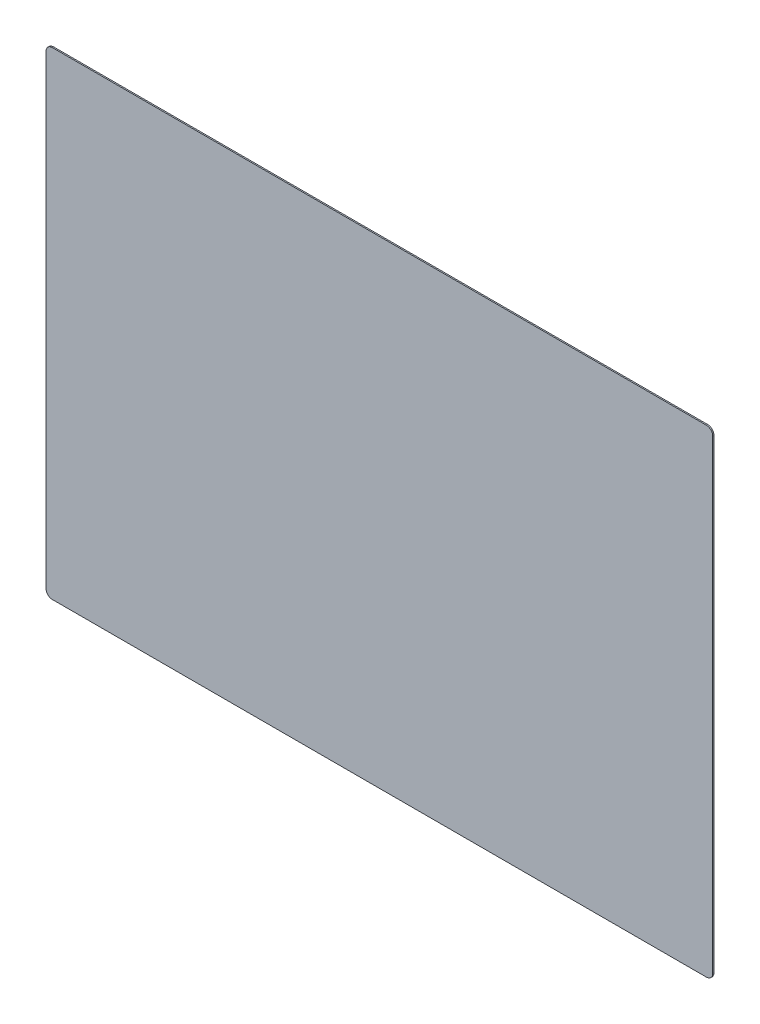
ISO-10303-21;
HEADER;
FILE_DESCRIPTION(('STEP AP214'),'2;1');
FILE_NAME('part.step','',(''),(''),'','','');
FILE_SCHEMA(('AUTOMOTIVE_DESIGN { 1 0 10303 214 1 1 1 1 }'));
ENDSEC;
DATA;
#1=APPLICATION_CONTEXT('core data for automotive mechanical design processes');
#2=APPLICATION_PROTOCOL_DEFINITION('international standard','automotive_design',2000,#1);
#3=PRODUCT_CONTEXT('',#1,'mechanical');
#4=PRODUCT('Part','Part','',(#3));
#5=PRODUCT_RELATED_PRODUCT_CATEGORY('part','',(#4));
#6=PRODUCT_DEFINITION_FORMATION('','',#4);
#7=PRODUCT_DEFINITION_CONTEXT('part definition',#1,'design');
#8=PRODUCT_DEFINITION('design','',#6,#7);
#9=PRODUCT_DEFINITION_SHAPE('','',#8);
#10=(LENGTH_UNIT() NAMED_UNIT(*) SI_UNIT(.MILLI.,.METRE.));
#11=(NAMED_UNIT(*) PLANE_ANGLE_UNIT() SI_UNIT($,.RADIAN.));
#12=(NAMED_UNIT(*) SI_UNIT($,.STERADIAN.) SOLID_ANGLE_UNIT());
#13=UNCERTAINTY_MEASURE_WITH_UNIT(LENGTH_MEASURE(1.E-05),#10,'distance_accuracy_value','');
#14=(GEOMETRIC_REPRESENTATION_CONTEXT(3) GLOBAL_UNCERTAINTY_ASSIGNED_CONTEXT((#13)) GLOBAL_UNIT_ASSIGNED_CONTEXT((#10,
#11,#12)) REPRESENTATION_CONTEXT('',''));
#15=CARTESIAN_POINT('',(0.,0.,0.));
#16=DIRECTION('',(0.,0.,1.));
#17=DIRECTION('',(1.,0.,0.));
#18=AXIS2_PLACEMENT_3D('',#15,#16,#17);
#19=CARTESIAN_POINT('',(0.,0.,0.100000000000003));
#20=DIRECTION('',(0.,0.,-1.));
#21=DIRECTION('',(-1.,0.,0.));
#22=AXIS2_PLACEMENT_3D('',#19,#20,#21);
#23=PLANE('',#22);
#24=CARTESIAN_POINT('',(-26.,18.5,0.0999999999999959));
#25=DIRECTION('',(0.,0.,-1.));
#26=DIRECTION('',(-1.,0.,0.));
#27=AXIS2_PLACEMENT_3D('',#24,#25,#26);
#28=CIRCLE('',#27,0.5);
#29=CARTESIAN_POINT('',(-26.5,18.5,0.0999999999999959));
#30=VERTEX_POINT('',#29);
#31=CARTESIAN_POINT('',(-26.,19.,0.0999999999999959));
#32=VERTEX_POINT('',#31);
#33=EDGE_CURVE('E89',#30,#32,#28,.T.);
#34=ORIENTED_EDGE('',*,*,#33,.F.);
#35=DIRECTION('',(0.,1.,0.));
#36=VECTOR('',#35,1.);
#37=CARTESIAN_POINT('',(-26.5,-19.,0.0999999999999959));
#38=LINE('',#37,#36);
#39=CARTESIAN_POINT('',(-26.5,-18.5,0.0999999999999959));
#40=VERTEX_POINT('',#39);
#41=EDGE_CURVE('E86',#30,#40,#38,.F.);
#42=ORIENTED_EDGE('',*,*,#41,.T.);
#43=CARTESIAN_POINT('',(-26.,-18.5,0.0999999999999959));
#44=DIRECTION('',(0.,0.,-1.));
#45=DIRECTION('',(-1.,0.,0.));
#46=AXIS2_PLACEMENT_3D('',#43,#44,#45);
#47=CIRCLE('',#46,0.5);
#48=CARTESIAN_POINT('',(-26.,-19.,0.0999999999999959));
#49=VERTEX_POINT('',#48);
#50=EDGE_CURVE('E20',#49,#40,#47,.T.);
#51=ORIENTED_EDGE('',*,*,#50,.F.);
#52=DIRECTION('',(1.,0.,0.));
#53=VECTOR('',#52,1.);
#54=CARTESIAN_POINT('',(-26.5,-19.,0.0999999999999959));
#55=LINE('',#54,#53);
#56=CARTESIAN_POINT('',(26.,-19.,0.0999999999999959));
#57=VERTEX_POINT('',#56);
#58=EDGE_CURVE('E96',#49,#57,#55,.T.);
#59=ORIENTED_EDGE('',*,*,#58,.T.);
#60=CARTESIAN_POINT('',(26.,-18.5,0.0999999999999959));
#61=DIRECTION('',(0.,0.,-1.));
#62=DIRECTION('',(-1.,0.,0.));
#63=AXIS2_PLACEMENT_3D('',#60,#61,#62);
#64=CIRCLE('',#63,0.5);
#65=CARTESIAN_POINT('',(26.5,-18.5,0.0999999999999959));
#66=VERTEX_POINT('',#65);
#67=EDGE_CURVE('E108',#66,#57,#64,.T.);
#68=ORIENTED_EDGE('',*,*,#67,.F.);
#69=DIRECTION('',(0.,1.,0.));
#70=VECTOR('',#69,1.);
#71=CARTESIAN_POINT('',(26.5,-19.,0.0999999999999959));
#72=LINE('',#71,#70);
#73=CARTESIAN_POINT('',(26.5,18.5,0.0999999999999959));
#74=VERTEX_POINT('',#73);
#75=EDGE_CURVE('E111',#66,#74,#72,.T.);
#76=ORIENTED_EDGE('',*,*,#75,.T.);
#77=CARTESIAN_POINT('',(26.,18.5,0.0999999999999959));
#78=DIRECTION('',(0.,0.,-1.));
#79=DIRECTION('',(-1.,0.,0.));
#80=AXIS2_PLACEMENT_3D('',#77,#78,#79);
#81=CIRCLE('',#80,0.5);
#82=CARTESIAN_POINT('',(26.,19.,0.0999999999999959));
#83=VERTEX_POINT('',#82);
#84=EDGE_CURVE('E115',#83,#74,#81,.T.);
#85=ORIENTED_EDGE('',*,*,#84,.F.);
#86=DIRECTION('',(1.,0.,0.));
#87=VECTOR('',#86,1.);
#88=CARTESIAN_POINT('',(-26.5,19.,0.0999999999999959));
#89=LINE('',#88,#87);
#90=EDGE_CURVE('E118',#83,#32,#89,.F.);
#91=ORIENTED_EDGE('',*,*,#90,.T.);
#92=EDGE_LOOP('',(#34,#42,#51,#59,#68,#76,#85,#91));
#93=FACE_BOUND('',#92,.T.);
#94=ADVANCED_FACE('F17',(#93),#23,.F.);
#95=CARTESIAN_POINT('',(-26.5,-19.,0.0999999999999959));
#96=DIRECTION('',(1.,0.,0.));
#97=DIRECTION('',(0.,0.,-1.));
#98=AXIS2_PLACEMENT_3D('',#95,#96,#97);
#99=PLANE('',#98);
#100=DIRECTION('',(0.,0.,-1.));
#101=VECTOR('',#100,1.);
#102=CARTESIAN_POINT('',(-26.5,18.5,0.0999999999999959));
#103=LINE('',#102,#101);
#104=CARTESIAN_POINT('',(-26.5,18.5,0.));
#105=VERTEX_POINT('',#104);
#106=EDGE_CURVE('E119',#105,#30,#103,.F.);
#107=ORIENTED_EDGE('',*,*,#106,.F.);
#108=DIRECTION('',(0.,1.,0.));
#109=VECTOR('',#108,1.);
#110=CARTESIAN_POINT('',(-26.5,0.,0.));
#111=LINE('',#110,#109);
#112=CARTESIAN_POINT('',(-26.5,-18.5,0.));
#113=VERTEX_POINT('',#112);
#114=EDGE_CURVE('E95',#113,#105,#111,.T.);
#115=ORIENTED_EDGE('',*,*,#114,.F.);
#116=DIRECTION('',(0.,0.,-1.));
#117=VECTOR('',#116,1.);
#118=CARTESIAN_POINT('',(-26.5,-18.5,0.0999999999999959));
#119=LINE('',#118,#117);
#120=EDGE_CURVE('E85',#40,#113,#119,.T.);
#121=ORIENTED_EDGE('',*,*,#120,.F.);
#122=ORIENTED_EDGE('',*,*,#41,.F.);
#123=EDGE_LOOP('',(#107,#115,#121,#122));
#124=FACE_BOUND('',#123,.T.);
#125=ADVANCED_FACE('F93',(#124),#99,.F.);
#126=CARTESIAN_POINT('',(-26.,18.5,0.0999999999999959));
#127=DIRECTION('',(0.,0.,-1.));
#128=DIRECTION('',(-1.,0.,0.));
#129=AXIS2_PLACEMENT_3D('',#126,#127,#128);
#130=CYLINDRICAL_SURFACE('',#129,0.5);
#131=CARTESIAN_POINT('',(-26.,18.5,0.));
#132=DIRECTION('',(0.,0.,-1.));
#133=DIRECTION('',(-1.,0.,0.));
#134=AXIS2_PLACEMENT_3D('',#131,#132,#133);
#135=CIRCLE('',#134,0.5);
#136=CARTESIAN_POINT('',(-26.,19.,0.));
#137=VERTEX_POINT('',#136);
#138=EDGE_CURVE('E132',#105,#137,#135,.T.);
#139=ORIENTED_EDGE('',*,*,#138,.F.);
#140=ORIENTED_EDGE('',*,*,#106,.T.);
#141=ORIENTED_EDGE('',*,*,#33,.T.);
#142=DIRECTION('',(0.,0.,-1.));
#143=VECTOR('',#142,1.);
#144=CARTESIAN_POINT('',(-26.,19.,0.0999999999999959));
#145=LINE('',#144,#143);
#146=EDGE_CURVE('E116',#32,#137,#145,.T.);
#147=ORIENTED_EDGE('',*,*,#146,.T.);
#148=EDGE_LOOP('',(#139,#140,#141,#147));
#149=FACE_BOUND('',#148,.T.);
#150=ADVANCED_FACE('F139',(#149),#130,.T.);
#151=CARTESIAN_POINT('',(-26.5,19.,0.0999999999999959));
#152=DIRECTION('',(0.,-1.,0.));
#153=DIRECTION('',(0.,0.,-1.));
#154=AXIS2_PLACEMENT_3D('',#151,#152,#153);
#155=PLANE('',#154);
#156=ORIENTED_EDGE('',*,*,#146,.F.);
#157=ORIENTED_EDGE('',*,*,#90,.F.);
#158=DIRECTION('',(0.,0.,-1.));
#159=VECTOR('',#158,1.);
#160=CARTESIAN_POINT('',(26.,19.,0.0999999999999959));
#161=LINE('',#160,#159);
#162=CARTESIAN_POINT('',(26.,19.,0.));
#163=VERTEX_POINT('',#162);
#164=EDGE_CURVE('E112',#163,#83,#161,.F.);
#165=ORIENTED_EDGE('',*,*,#164,.F.);
#166=DIRECTION('',(-1.,0.,0.));
#167=VECTOR('',#166,1.);
#168=CARTESIAN_POINT('',(0.,19.,0.));
#169=LINE('',#168,#167);
#170=EDGE_CURVE('E131',#137,#163,#169,.F.);
#171=ORIENTED_EDGE('',*,*,#170,.F.);
#172=EDGE_LOOP('',(#156,#157,#165,#171));
#173=FACE_BOUND('',#172,.T.);
#174=ADVANCED_FACE('F143',(#173),#155,.F.);
#175=CARTESIAN_POINT('',(26.,18.5,0.0999999999999959));
#176=DIRECTION('',(0.,0.,-1.));
#177=DIRECTION('',(-1.,0.,0.));
#178=AXIS2_PLACEMENT_3D('',#175,#176,#177);
#179=CYLINDRICAL_SURFACE('',#178,0.5);
#180=CARTESIAN_POINT('',(26.,18.5,0.));
#181=DIRECTION('',(0.,0.,-1.));
#182=DIRECTION('',(-1.,0.,0.));
#183=AXIS2_PLACEMENT_3D('',#180,#181,#182);
#184=CIRCLE('',#183,0.5);
#185=CARTESIAN_POINT('',(26.5,18.5,0.));
#186=VERTEX_POINT('',#185);
#187=EDGE_CURVE('E128',#163,#186,#184,.T.);
#188=ORIENTED_EDGE('',*,*,#187,.F.);
#189=ORIENTED_EDGE('',*,*,#164,.T.);
#190=ORIENTED_EDGE('',*,*,#84,.T.);
#191=DIRECTION('',(0.,0.,1.));
#192=VECTOR('',#191,1.);
#193=CARTESIAN_POINT('',(26.5,18.5,0.0999999999999959));
#194=LINE('',#193,#192);
#195=EDGE_CURVE('E109',#74,#186,#194,.F.);
#196=ORIENTED_EDGE('',*,*,#195,.T.);
#197=EDGE_LOOP('',(#188,#189,#190,#196));
#198=FACE_BOUND('',#197,.T.);
#199=ADVANCED_FACE('F163',(#198),#179,.T.);
#200=CARTESIAN_POINT('',(26.5,-19.,0.0999999999999959));
#201=DIRECTION('',(-1.,0.,0.));
#202=DIRECTION('',(0.,0.,1.));
#203=AXIS2_PLACEMENT_3D('',#200,#201,#202);
#204=PLANE('',#203);
#205=DIRECTION('',(0.,0.,-1.));
#206=VECTOR('',#205,1.);
#207=CARTESIAN_POINT('',(26.5,-18.5,0.0999999999999959));
#208=LINE('',#207,#206);
#209=CARTESIAN_POINT('',(26.5,-18.5,0.));
#210=VERTEX_POINT('',#209);
#211=EDGE_CURVE('E105',#210,#66,#208,.F.);
#212=ORIENTED_EDGE('',*,*,#211,.F.);
#213=DIRECTION('',(0.,1.,0.));
#214=VECTOR('',#213,1.);
#215=CARTESIAN_POINT('',(26.5,0.,0.));
#216=LINE('',#215,#214);
#217=EDGE_CURVE('E127',#186,#210,#216,.F.);
#218=ORIENTED_EDGE('',*,*,#217,.F.);
#219=ORIENTED_EDGE('',*,*,#195,.F.);
#220=ORIENTED_EDGE('',*,*,#75,.F.);
#221=EDGE_LOOP('',(#212,#218,#219,#220));
#222=FACE_BOUND('',#221,.T.);
#223=ADVANCED_FACE('F157',(#222),#204,.F.);
#224=CARTESIAN_POINT('',(26.,-18.5,0.0999999999999959));
#225=DIRECTION('',(0.,0.,-1.));
#226=DIRECTION('',(-1.,0.,0.));
#227=AXIS2_PLACEMENT_3D('',#224,#225,#226);
#228=CYLINDRICAL_SURFACE('',#227,0.5);
#229=CARTESIAN_POINT('',(26.,-18.5,0.));
#230=DIRECTION('',(0.,0.,-1.));
#231=DIRECTION('',(-1.,0.,0.));
#232=AXIS2_PLACEMENT_3D('',#229,#230,#231);
#233=CIRCLE('',#232,0.5);
#234=CARTESIAN_POINT('',(26.,-19.,0.));
#235=VERTEX_POINT('',#234);
#236=EDGE_CURVE('E124',#210,#235,#233,.T.);
#237=ORIENTED_EDGE('',*,*,#236,.F.);
#238=ORIENTED_EDGE('',*,*,#211,.T.);
#239=ORIENTED_EDGE('',*,*,#67,.T.);
#240=DIRECTION('',(0.,0.,1.));
#241=VECTOR('',#240,1.);
#242=CARTESIAN_POINT('',(26.,-19.,0.0999999999999959));
#243=LINE('',#242,#241);
#244=EDGE_CURVE('E99',#57,#235,#243,.F.);
#245=ORIENTED_EDGE('',*,*,#244,.T.);
#246=EDGE_LOOP('',(#237,#238,#239,#245));
#247=FACE_BOUND('',#246,.T.);
#248=ADVANCED_FACE('F160',(#247),#228,.T.);
#249=CARTESIAN_POINT('',(-26.5,-19.,0.0999999999999959));
#250=DIRECTION('',(0.,1.,0.));
#251=DIRECTION('',(0.,0.,1.));
#252=AXIS2_PLACEMENT_3D('',#249,#250,#251);
#253=PLANE('',#252);
#254=DIRECTION('',(0.,0.,-1.));
#255=VECTOR('',#254,1.);
#256=CARTESIAN_POINT('',(-26.,-19.,0.0999999999999959));
#257=LINE('',#256,#255);
#258=CARTESIAN_POINT('',(-26.,-19.,0.));
#259=VERTEX_POINT('',#258);
#260=EDGE_CURVE('E35',#259,#49,#257,.F.);
#261=ORIENTED_EDGE('',*,*,#260,.F.);
#262=DIRECTION('',(-1.,0.,0.));
#263=VECTOR('',#262,1.);
#264=CARTESIAN_POINT('',(0.,-19.,0.));
#265=LINE('',#264,#263);
#266=EDGE_CURVE('E26',#235,#259,#265,.T.);
#267=ORIENTED_EDGE('',*,*,#266,.F.);
#268=ORIENTED_EDGE('',*,*,#244,.F.);
#269=ORIENTED_EDGE('',*,*,#58,.F.);
#270=EDGE_LOOP('',(#261,#267,#268,#269));
#271=FACE_BOUND('',#270,.T.);
#272=ADVANCED_FACE('F161',(#271),#253,.F.);
#273=CARTESIAN_POINT('',(-26.,-18.5,0.0999999999999959));
#274=DIRECTION('',(0.,0.,-1.));
#275=DIRECTION('',(-1.,0.,0.));
#276=AXIS2_PLACEMENT_3D('',#273,#274,#275);
#277=CYLINDRICAL_SURFACE('',#276,0.5);
#278=CARTESIAN_POINT('',(-26.,-18.5,0.));
#279=DIRECTION('',(0.,0.,-1.));
#280=DIRECTION('',(-1.,0.,0.));
#281=AXIS2_PLACEMENT_3D('',#278,#279,#280);
#282=CIRCLE('',#281,0.5);
#283=EDGE_CURVE('E11',#259,#113,#282,.T.);
#284=ORIENTED_EDGE('',*,*,#283,.F.);
#285=ORIENTED_EDGE('',*,*,#260,.T.);
#286=ORIENTED_EDGE('',*,*,#50,.T.);
#287=ORIENTED_EDGE('',*,*,#120,.T.);
#288=EDGE_LOOP('',(#284,#285,#286,#287));
#289=FACE_BOUND('',#288,.T.);
#290=ADVANCED_FACE('F83',(#289),#277,.T.);
#291=CARTESIAN_POINT('',(0.,0.,0.));
#292=DIRECTION('',(0.,0.,-1.));
#293=DIRECTION('',(-1.,0.,0.));
#294=AXIS2_PLACEMENT_3D('',#291,#292,#293);
#295=PLANE('',#294);
#296=ORIENTED_EDGE('',*,*,#266,.T.);
#297=ORIENTED_EDGE('',*,*,#283,.T.);
#298=ORIENTED_EDGE('',*,*,#114,.T.);
#299=ORIENTED_EDGE('',*,*,#138,.T.);
#300=ORIENTED_EDGE('',*,*,#170,.T.);
#301=ORIENTED_EDGE('',*,*,#187,.T.);
#302=ORIENTED_EDGE('',*,*,#217,.T.);
#303=ORIENTED_EDGE('',*,*,#236,.T.);
#304=EDGE_LOOP('',(#296,#297,#298,#299,#300,#301,#302,#303));
#305=FACE_BOUND('',#304,.T.);
#306=ADVANCED_FACE('F148',(#305),#295,.T.);
#307=CLOSED_SHELL('',(#94,#125,#150,#174,#199,#223,#248,#272,#290,#306));
#308=MANIFOLD_SOLID_BREP('B1',#307);
#309=ADVANCED_BREP_SHAPE_REPRESENTATION('',(#18,#308),#14);
#310=SHAPE_DEFINITION_REPRESENTATION(#9,#309);
ENDSEC;
END-ISO-10303-21;
